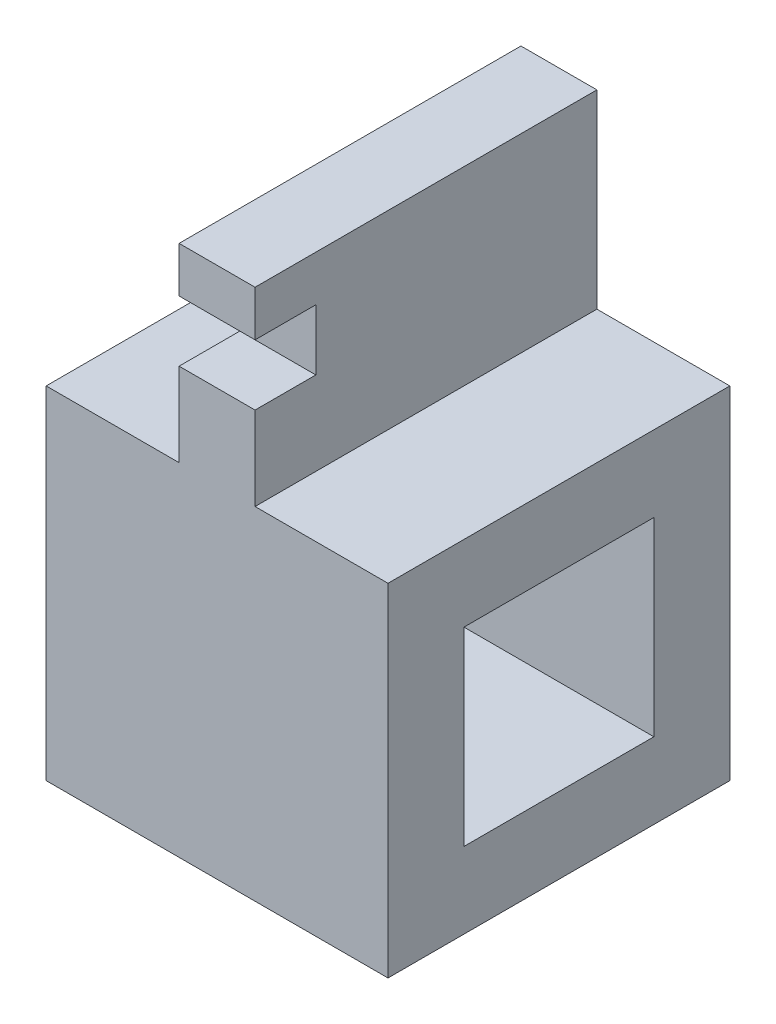
ISO-10303-21;
HEADER;
FILE_DESCRIPTION(('STEP AP214'),'2;1');
FILE_NAME('part.step','',(''),(''),'','','');
FILE_SCHEMA(('AUTOMOTIVE_DESIGN { 1 0 10303 214 1 1 1 1 }'));
ENDSEC;
DATA;
#1=APPLICATION_CONTEXT('core data for automotive mechanical design processes');
#2=APPLICATION_PROTOCOL_DEFINITION('international standard','automotive_design',2000,#1);
#3=PRODUCT_CONTEXT('',#1,'mechanical');
#4=PRODUCT('Part','Part','',(#3));
#5=PRODUCT_RELATED_PRODUCT_CATEGORY('part','',(#4));
#6=PRODUCT_DEFINITION_FORMATION('','',#4);
#7=PRODUCT_DEFINITION_CONTEXT('part definition',#1,'design');
#8=PRODUCT_DEFINITION('design','',#6,#7);
#9=PRODUCT_DEFINITION_SHAPE('','',#8);
#10=(LENGTH_UNIT() NAMED_UNIT(*) SI_UNIT(.MILLI.,.METRE.));
#11=(NAMED_UNIT(*) PLANE_ANGLE_UNIT() SI_UNIT($,.RADIAN.));
#12=(NAMED_UNIT(*) SI_UNIT($,.STERADIAN.) SOLID_ANGLE_UNIT());
#13=UNCERTAINTY_MEASURE_WITH_UNIT(LENGTH_MEASURE(1.E-05),#10,'distance_accuracy_value','');
#14=(GEOMETRIC_REPRESENTATION_CONTEXT(3) GLOBAL_UNCERTAINTY_ASSIGNED_CONTEXT((#13)) GLOBAL_UNIT_ASSIGNED_CONTEXT((#10,
#11,#12)) REPRESENTATION_CONTEXT('',''));
#15=CARTESIAN_POINT('',(0.,0.,0.));
#16=DIRECTION('',(0.,0.,1.));
#17=DIRECTION('',(1.,0.,0.));
#18=AXIS2_PLACEMENT_3D('',#15,#16,#17);
#19=CARTESIAN_POINT('',(9.,-4.5,4.5));
#20=DIRECTION('',(0.,0.,-1.));
#21=DIRECTION('',(0.,1.,0.));
#22=AXIS2_PLACEMENT_3D('',#19,#20,#21);
#23=PLANE('',#22);
#24=DIRECTION('',(-1.,0.,0.));
#25=VECTOR('',#24,1.);
#26=CARTESIAN_POINT('',(8.5,8.3,4.5));
#27=LINE('',#26,#25);
#28=CARTESIAN_POINT('',(5.5,8.3,4.5));
#29=VERTEX_POINT('',#28);
#30=CARTESIAN_POINT('',(3.5,8.3,4.5));
#31=VERTEX_POINT('',#30);
#32=EDGE_CURVE('E163',#29,#31,#27,.T.);
#33=ORIENTED_EDGE('',*,*,#32,.F.);
#34=DIRECTION('',(0.,-1.,0.));
#35=VECTOR('',#34,1.);
#36=CARTESIAN_POINT('',(5.5,9.5,4.5));
#37=LINE('',#36,#35);
#38=CARTESIAN_POINT('',(5.5,9.5,4.5));
#39=VERTEX_POINT('',#38);
#40=EDGE_CURVE('E197',#39,#29,#37,.T.);
#41=ORIENTED_EDGE('',*,*,#40,.F.);
#42=DIRECTION('',(1.,0.,0.));
#43=VECTOR('',#42,1.);
#44=CARTESIAN_POINT('',(0.,9.5,4.5));
#45=LINE('',#44,#43);
#46=CARTESIAN_POINT('',(3.5,9.5,4.5));
#47=VERTEX_POINT('',#46);
#48=EDGE_CURVE('E180',#47,#39,#45,.T.);
#49=ORIENTED_EDGE('',*,*,#48,.F.);
#50=DIRECTION('',(0.,-1.,0.));
#51=VECTOR('',#50,1.);
#52=CARTESIAN_POINT('',(3.5,9.5,4.5));
#53=LINE('',#52,#51);
#54=EDGE_CURVE('E201',#47,#31,#53,.T.);
#55=ORIENTED_EDGE('',*,*,#54,.T.);
#56=EDGE_LOOP('',(#33,#41,#49,#55));
#57=FACE_BOUND('',#56,.T.);
#58=ADVANCED_FACE('F36',(#57),#23,.F.);
#59=CARTESIAN_POINT('',(3.5,9.5,0.));
#60=DIRECTION('',(-1.,0.,0.));
#61=DIRECTION('',(0.,0.,1.));
#62=AXIS2_PLACEMENT_3D('',#59,#60,#61);
#63=PLANE('',#62);
#64=DIRECTION('',(0.,1.,0.));
#65=VECTOR('',#64,1.);
#66=CARTESIAN_POINT('',(3.5,0.,2.9));
#67=LINE('',#66,#65);
#68=CARTESIAN_POINT('',(3.5,6.7,2.9));
#69=VERTEX_POINT('',#68);
#70=CARTESIAN_POINT('',(3.5,8.3,2.9));
#71=VERTEX_POINT('',#70);
#72=EDGE_CURVE('E151',#69,#71,#67,.T.);
#73=ORIENTED_EDGE('',*,*,#72,.T.);
#74=DIRECTION('',(0.,0.,1.));
#75=VECTOR('',#74,1.);
#76=CARTESIAN_POINT('',(3.5,8.3,0.));
#77=LINE('',#76,#75);
#78=EDGE_CURVE('E160',#71,#31,#77,.T.);
#79=ORIENTED_EDGE('',*,*,#78,.T.);
#80=ORIENTED_EDGE('',*,*,#54,.F.);
#81=DIRECTION('',(0.,0.,-1.));
#82=VECTOR('',#81,1.);
#83=CARTESIAN_POINT('',(3.5,9.5,0.));
#84=LINE('',#83,#82);
#85=CARTESIAN_POINT('',(3.5,9.5,-4.5));
#86=VERTEX_POINT('',#85);
#87=EDGE_CURVE('E177',#47,#86,#84,.T.);
#88=ORIENTED_EDGE('',*,*,#87,.T.);
#89=DIRECTION('',(0.,-1.,0.));
#90=VECTOR('',#89,1.);
#91=CARTESIAN_POINT('',(3.5,9.5,-4.5));
#92=LINE('',#91,#90);
#93=CARTESIAN_POINT('',(3.5,4.5,-4.5));
#94=VERTEX_POINT('',#93);
#95=EDGE_CURVE('E187',#86,#94,#92,.T.);
#96=ORIENTED_EDGE('',*,*,#95,.T.);
#97=DIRECTION('',(0.,0.,-1.));
#98=VECTOR('',#97,1.);
#99=CARTESIAN_POINT('',(3.5,4.5,0.));
#100=LINE('',#99,#98);
#101=CARTESIAN_POINT('',(3.5,4.5,4.5));
#102=VERTEX_POINT('',#101);
#103=EDGE_CURVE('E59',#102,#94,#100,.T.);
#104=ORIENTED_EDGE('',*,*,#103,.F.);
#105=CARTESIAN_POINT('',(3.5,6.7,4.5));
#106=VERTEX_POINT('',#105);
#107=EDGE_CURVE('E200',#106,#102,#53,.T.);
#108=ORIENTED_EDGE('',*,*,#107,.F.);
#109=DIRECTION('',(0.,0.,1.));
#110=VECTOR('',#109,1.);
#111=CARTESIAN_POINT('',(3.5,6.7,0.));
#112=LINE('',#111,#110);
#113=EDGE_CURVE('E157',#69,#106,#112,.T.);
#114=ORIENTED_EDGE('',*,*,#113,.F.);
#115=EDGE_LOOP('',(#73,#79,#80,#88,#96,#104,#108,#114));
#116=FACE_BOUND('',#115,.T.);
#117=ADVANCED_FACE('F167',(#116),#63,.T.);
#118=CARTESIAN_POINT('',(5.5,9.5,0.));
#119=DIRECTION('',(-1.,0.,0.));
#120=DIRECTION('',(0.,0.,1.));
#121=AXIS2_PLACEMENT_3D('',#118,#119,#120);
#122=PLANE('',#121);
#123=DIRECTION('',(0.,0.,1.));
#124=VECTOR('',#123,1.);
#125=CARTESIAN_POINT('',(5.5,8.3,0.));
#126=LINE('',#125,#124);
#127=CARTESIAN_POINT('',(5.5,8.3,2.9));
#128=VERTEX_POINT('',#127);
#129=EDGE_CURVE('E11',#128,#29,#126,.T.);
#130=ORIENTED_EDGE('',*,*,#129,.F.);
#131=DIRECTION('',(0.,1.,0.));
#132=VECTOR('',#131,1.);
#133=CARTESIAN_POINT('',(5.5,9.5,2.9));
#134=LINE('',#133,#132);
#135=CARTESIAN_POINT('',(5.5,6.7,2.9));
#136=VERTEX_POINT('',#135);
#137=EDGE_CURVE('E154',#136,#128,#134,.T.);
#138=ORIENTED_EDGE('',*,*,#137,.F.);
#139=DIRECTION('',(0.,0.,1.));
#140=VECTOR('',#139,1.);
#141=CARTESIAN_POINT('',(5.5,6.7,0.));
#142=LINE('',#141,#140);
#143=CARTESIAN_POINT('',(5.5,6.7,4.5));
#144=VERTEX_POINT('',#143);
#145=EDGE_CURVE('E44',#136,#144,#142,.T.);
#146=ORIENTED_EDGE('',*,*,#145,.T.);
#147=CARTESIAN_POINT('',(5.5,4.5,4.5));
#148=VERTEX_POINT('',#147);
#149=EDGE_CURVE('E196',#144,#148,#37,.T.);
#150=ORIENTED_EDGE('',*,*,#149,.T.);
#151=DIRECTION('',(0.,0.,-1.));
#152=VECTOR('',#151,1.);
#153=CARTESIAN_POINT('',(5.5,4.5,0.));
#154=LINE('',#153,#152);
#155=CARTESIAN_POINT('',(5.5,4.5,-4.5));
#156=VERTEX_POINT('',#155);
#157=EDGE_CURVE('E181',#148,#156,#154,.T.);
#158=ORIENTED_EDGE('',*,*,#157,.T.);
#159=DIRECTION('',(0.,-1.,0.));
#160=VECTOR('',#159,1.);
#161=CARTESIAN_POINT('',(5.5,9.5,-4.5));
#162=LINE('',#161,#160);
#163=CARTESIAN_POINT('',(5.5,9.5,-4.5));
#164=VERTEX_POINT('',#163);
#165=EDGE_CURVE('E193',#164,#156,#162,.T.);
#166=ORIENTED_EDGE('',*,*,#165,.F.);
#167=DIRECTION('',(0.,0.,-1.));
#168=VECTOR('',#167,1.);
#169=CARTESIAN_POINT('',(5.5,9.5,0.));
#170=LINE('',#169,#168);
#171=EDGE_CURVE('E183',#39,#164,#170,.T.);
#172=ORIENTED_EDGE('',*,*,#171,.F.);
#173=ORIENTED_EDGE('',*,*,#40,.T.);
#174=EDGE_LOOP('',(#130,#138,#146,#150,#158,#166,#172,#173));
#175=FACE_BOUND('',#174,.T.);
#176=ADVANCED_FACE('F270',(#175),#122,.F.);
#177=CARTESIAN_POINT('',(9.,4.5,-4.5));
#178=DIRECTION('',(0.,-1.,0.));
#179=DIRECTION('',(0.,0.,-1.));
#180=AXIS2_PLACEMENT_3D('',#177,#178,#179);
#181=PLANE('',#180);
#182=ORIENTED_EDGE('',*,*,#157,.F.);
#183=DIRECTION('',(-1.,0.,0.));
#184=VECTOR('',#183,1.);
#185=CARTESIAN_POINT('',(9.,4.5,4.5));
#186=LINE('',#185,#184);
#187=CARTESIAN_POINT('',(9.,4.5,4.5));
#188=VERTEX_POINT('',#187);
#189=EDGE_CURVE('E255',#188,#148,#186,.T.);
#190=ORIENTED_EDGE('',*,*,#189,.F.);
#191=DIRECTION('',(0.,0.,1.));
#192=VECTOR('',#191,1.);
#193=CARTESIAN_POINT('',(9.,4.5,-4.5));
#194=LINE('',#193,#192);
#195=CARTESIAN_POINT('',(9.,4.5,-4.5));
#196=VERTEX_POINT('',#195);
#197=EDGE_CURVE('E243',#196,#188,#194,.T.);
#198=ORIENTED_EDGE('',*,*,#197,.F.);
#199=DIRECTION('',(-1.,0.,0.));
#200=VECTOR('',#199,1.);
#201=CARTESIAN_POINT('',(9.,4.5,-4.5));
#202=LINE('',#201,#200);
#203=EDGE_CURVE('E259',#196,#156,#202,.T.);
#204=ORIENTED_EDGE('',*,*,#203,.T.);
#205=EDGE_LOOP('',(#182,#190,#198,#204));
#206=FACE_BOUND('',#205,.T.);
#207=ADVANCED_FACE('F279',(#206),#181,.F.);
#208=CARTESIAN_POINT('',(9.,0.,0.));
#209=DIRECTION('',(1.,0.,0.));
#210=DIRECTION('',(0.,0.,-1.));
#211=AXIS2_PLACEMENT_3D('',#208,#209,#210);
#212=PLANE('',#211);
#213=DIRECTION('',(0.,-1.,0.));
#214=VECTOR('',#213,1.);
#215=CARTESIAN_POINT('',(9.,-4.5,4.5));
#216=LINE('',#215,#214);
#217=CARTESIAN_POINT('',(9.,-4.5,4.5));
#218=VERTEX_POINT('',#217);
#219=EDGE_CURVE('E235',#188,#218,#216,.T.);
#220=ORIENTED_EDGE('',*,*,#219,.T.);
#221=DIRECTION('',(0.,0.,-1.));
#222=VECTOR('',#221,1.);
#223=CARTESIAN_POINT('',(9.,-4.5,-4.5));
#224=LINE('',#223,#222);
#225=CARTESIAN_POINT('',(9.,-4.5,-4.5));
#226=VERTEX_POINT('',#225);
#227=EDGE_CURVE('E238',#218,#226,#224,.T.);
#228=ORIENTED_EDGE('',*,*,#227,.T.);
#229=DIRECTION('',(0.,1.,0.));
#230=VECTOR('',#229,1.);
#231=CARTESIAN_POINT('',(9.,-4.5,-4.5));
#232=LINE('',#231,#230);
#233=EDGE_CURVE('E241',#226,#196,#232,.T.);
#234=ORIENTED_EDGE('',*,*,#233,.T.);
#235=ORIENTED_EDGE('',*,*,#197,.T.);
#236=EDGE_LOOP('',(#220,#228,#234,#235));
#237=FACE_BOUND('',#236,.T.);
#238=DIRECTION('',(0.,0.,-1.));
#239=VECTOR('',#238,1.);
#240=CARTESIAN_POINT('',(9.,-2.5,-2.5));
#241=LINE('',#240,#239);
#242=CARTESIAN_POINT('',(9.,-2.5,2.5));
#243=VERTEX_POINT('',#242);
#244=CARTESIAN_POINT('',(9.,-2.5,-2.5));
#245=VERTEX_POINT('',#244);
#246=EDGE_CURVE('E206',#243,#245,#241,.T.);
#247=ORIENTED_EDGE('',*,*,#246,.F.);
#248=DIRECTION('',(0.,-1.,0.));
#249=VECTOR('',#248,1.);
#250=CARTESIAN_POINT('',(9.,-2.5,2.5));
#251=LINE('',#250,#249);
#252=CARTESIAN_POINT('',(9.,2.5,2.5));
#253=VERTEX_POINT('',#252);
#254=EDGE_CURVE('E204',#253,#243,#251,.T.);
#255=ORIENTED_EDGE('',*,*,#254,.F.);
#256=DIRECTION('',(0.,0.,1.));
#257=VECTOR('',#256,1.);
#258=CARTESIAN_POINT('',(9.,2.5,-2.5));
#259=LINE('',#258,#257);
#260=CARTESIAN_POINT('',(9.,2.5,-2.5));
#261=VERTEX_POINT('',#260);
#262=EDGE_CURVE('E212',#261,#253,#259,.T.);
#263=ORIENTED_EDGE('',*,*,#262,.F.);
#264=DIRECTION('',(0.,1.,0.));
#265=VECTOR('',#264,1.);
#266=CARTESIAN_POINT('',(9.,-2.5,-2.5));
#267=LINE('',#266,#265);
#268=EDGE_CURVE('E209',#245,#261,#267,.T.);
#269=ORIENTED_EDGE('',*,*,#268,.F.);
#270=EDGE_LOOP('',(#247,#255,#263,#269));
#271=FACE_BOUND('',#270,.T.);
#272=ADVANCED_FACE('F305',(#237,#271),#212,.T.);
#273=CARTESIAN_POINT('',(0.,0.,0.));
#274=DIRECTION('',(1.,0.,0.));
#275=DIRECTION('',(0.,0.,-1.));
#276=AXIS2_PLACEMENT_3D('',#273,#274,#275);
#277=PLANE('',#276);
#278=DIRECTION('',(0.,-1.,0.));
#279=VECTOR('',#278,1.);
#280=CARTESIAN_POINT('',(0.,-4.5,4.5));
#281=LINE('',#280,#279);
#282=CARTESIAN_POINT('',(0.,4.5,4.5));
#283=VERTEX_POINT('',#282);
#284=CARTESIAN_POINT('',(0.,-4.5,4.5));
#285=VERTEX_POINT('',#284);
#286=EDGE_CURVE('E234',#283,#285,#281,.T.);
#287=ORIENTED_EDGE('',*,*,#286,.F.);
#288=DIRECTION('',(0.,0.,1.));
#289=VECTOR('',#288,1.);
#290=CARTESIAN_POINT('',(0.,4.5,-4.5));
#291=LINE('',#290,#289);
#292=CARTESIAN_POINT('',(0.,4.5,-4.5));
#293=VERTEX_POINT('',#292);
#294=EDGE_CURVE('E239',#293,#283,#291,.T.);
#295=ORIENTED_EDGE('',*,*,#294,.F.);
#296=DIRECTION('',(0.,1.,0.));
#297=VECTOR('',#296,1.);
#298=CARTESIAN_POINT('',(0.,-4.5,-4.5));
#299=LINE('',#298,#297);
#300=CARTESIAN_POINT('',(0.,-4.5,-4.5));
#301=VERTEX_POINT('',#300);
#302=EDGE_CURVE('E250',#301,#293,#299,.T.);
#303=ORIENTED_EDGE('',*,*,#302,.F.);
#304=DIRECTION('',(0.,0.,-1.));
#305=VECTOR('',#304,1.);
#306=CARTESIAN_POINT('',(0.,-4.5,-4.5));
#307=LINE('',#306,#305);
#308=EDGE_CURVE('E248',#285,#301,#307,.T.);
#309=ORIENTED_EDGE('',*,*,#308,.F.);
#310=EDGE_LOOP('',(#287,#295,#303,#309));
#311=FACE_BOUND('',#310,.T.);
#312=DIRECTION('',(0.,-1.,0.));
#313=VECTOR('',#312,1.);
#314=CARTESIAN_POINT('',(0.,-2.5,2.5));
#315=LINE('',#314,#313);
#316=CARTESIAN_POINT('',(0.,2.5,2.5));
#317=VERTEX_POINT('',#316);
#318=CARTESIAN_POINT('',(0.,-2.5,2.5));
#319=VERTEX_POINT('',#318);
#320=EDGE_CURVE('E203',#317,#319,#315,.T.);
#321=ORIENTED_EDGE('',*,*,#320,.T.);
#322=DIRECTION('',(0.,0.,-1.));
#323=VECTOR('',#322,1.);
#324=CARTESIAN_POINT('',(0.,-2.5,-2.5));
#325=LINE('',#324,#323);
#326=CARTESIAN_POINT('',(0.,-2.5,-2.5));
#327=VERTEX_POINT('',#326);
#328=EDGE_CURVE('E217',#319,#327,#325,.T.);
#329=ORIENTED_EDGE('',*,*,#328,.T.);
#330=DIRECTION('',(0.,1.,0.));
#331=VECTOR('',#330,1.);
#332=CARTESIAN_POINT('',(0.,-2.5,-2.5));
#333=LINE('',#332,#331);
#334=CARTESIAN_POINT('',(0.,2.5,-2.5));
#335=VERTEX_POINT('',#334);
#336=EDGE_CURVE('E220',#327,#335,#333,.T.);
#337=ORIENTED_EDGE('',*,*,#336,.T.);
#338=DIRECTION('',(0.,0.,1.));
#339=VECTOR('',#338,1.);
#340=CARTESIAN_POINT('',(0.,2.5,-2.5));
#341=LINE('',#340,#339);
#342=EDGE_CURVE('E207',#335,#317,#341,.T.);
#343=ORIENTED_EDGE('',*,*,#342,.T.);
#344=EDGE_LOOP('',(#321,#329,#337,#343));
#345=FACE_BOUND('',#344,.T.);
#346=ADVANCED_FACE('F299',(#311,#345),#277,.F.);
#347=ORIENTED_EDGE('',*,*,#149,.F.);
#348=DIRECTION('',(-1.,0.,0.));
#349=VECTOR('',#348,1.);
#350=CARTESIAN_POINT('',(8.5,6.7,4.5));
#351=LINE('',#350,#349);
#352=EDGE_CURVE('E173',#144,#106,#351,.T.);
#353=ORIENTED_EDGE('',*,*,#352,.T.);
#354=ORIENTED_EDGE('',*,*,#107,.T.);
#355=EDGE_CURVE('E245',#102,#283,#186,.T.);
#356=ORIENTED_EDGE('',*,*,#355,.T.);
#357=ORIENTED_EDGE('',*,*,#286,.T.);
#358=DIRECTION('',(-1.,0.,0.));
#359=VECTOR('',#358,1.);
#360=CARTESIAN_POINT('',(9.,-4.5,4.5));
#361=LINE('',#360,#359);
#362=EDGE_CURVE('E264',#218,#285,#361,.T.);
#363=ORIENTED_EDGE('',*,*,#362,.F.);
#364=ORIENTED_EDGE('',*,*,#219,.F.);
#365=ORIENTED_EDGE('',*,*,#189,.T.);
#366=EDGE_LOOP('',(#347,#353,#354,#356,#357,#363,#364,#365));
#367=FACE_BOUND('',#366,.T.);
#368=ADVANCED_FACE('F38',(#367),#23,.F.);
#369=CARTESIAN_POINT('',(9.,-4.5,-4.5));
#370=DIRECTION('',(0.,1.,0.));
#371=DIRECTION('',(0.,0.,1.));
#372=AXIS2_PLACEMENT_3D('',#369,#370,#371);
#373=PLANE('',#372);
#374=ORIENTED_EDGE('',*,*,#308,.T.);
#375=DIRECTION('',(-1.,0.,0.));
#376=VECTOR('',#375,1.);
#377=CARTESIAN_POINT('',(9.,-4.5,-4.5));
#378=LINE('',#377,#376);
#379=EDGE_CURVE('E261',#226,#301,#378,.T.);
#380=ORIENTED_EDGE('',*,*,#379,.F.);
#381=ORIENTED_EDGE('',*,*,#227,.F.);
#382=ORIENTED_EDGE('',*,*,#362,.T.);
#383=EDGE_LOOP('',(#374,#380,#381,#382));
#384=FACE_BOUND('',#383,.T.);
#385=ADVANCED_FACE('F302',(#384),#373,.F.);
#386=CARTESIAN_POINT('',(9.,-4.5,-4.5));
#387=DIRECTION('',(0.,0.,1.));
#388=DIRECTION('',(0.,-1.,0.));
#389=AXIS2_PLACEMENT_3D('',#386,#387,#388);
#390=PLANE('',#389);
#391=ORIENTED_EDGE('',*,*,#302,.T.);
#392=EDGE_CURVE('E258',#94,#293,#202,.T.);
#393=ORIENTED_EDGE('',*,*,#392,.F.);
#394=ORIENTED_EDGE('',*,*,#95,.F.);
#395=DIRECTION('',(-1.,0.,0.));
#396=VECTOR('',#395,1.);
#397=CARTESIAN_POINT('',(0.,9.5,-4.5));
#398=LINE('',#397,#396);
#399=EDGE_CURVE('E185',#164,#86,#398,.T.);
#400=ORIENTED_EDGE('',*,*,#399,.F.);
#401=ORIENTED_EDGE('',*,*,#165,.T.);
#402=ORIENTED_EDGE('',*,*,#203,.F.);
#403=ORIENTED_EDGE('',*,*,#233,.F.);
#404=ORIENTED_EDGE('',*,*,#379,.T.);
#405=EDGE_LOOP('',(#391,#393,#394,#400,#401,#402,#403,#404));
#406=FACE_BOUND('',#405,.T.);
#407=ADVANCED_FACE('F285',(#406),#390,.F.);
#408=ORIENTED_EDGE('',*,*,#355,.F.);
#409=ORIENTED_EDGE('',*,*,#103,.T.);
#410=ORIENTED_EDGE('',*,*,#392,.T.);
#411=ORIENTED_EDGE('',*,*,#294,.T.);
#412=EDGE_LOOP('',(#408,#409,#410,#411));
#413=FACE_BOUND('',#412,.T.);
#414=ADVANCED_FACE('F294',(#413),#181,.F.);
#415=CARTESIAN_POINT('',(9.,-2.5,2.5));
#416=DIRECTION('',(0.,0.,-1.));
#417=DIRECTION('',(-1.,0.,0.));
#418=AXIS2_PLACEMENT_3D('',#415,#416,#417);
#419=PLANE('',#418);
#420=ORIENTED_EDGE('',*,*,#320,.F.);
#421=DIRECTION('',(-1.,0.,0.));
#422=VECTOR('',#421,1.);
#423=CARTESIAN_POINT('',(9.,2.5,2.5));
#424=LINE('',#423,#422);
#425=EDGE_CURVE('E214',#253,#317,#424,.T.);
#426=ORIENTED_EDGE('',*,*,#425,.F.);
#427=ORIENTED_EDGE('',*,*,#254,.T.);
#428=DIRECTION('',(-1.,0.,0.));
#429=VECTOR('',#428,1.);
#430=CARTESIAN_POINT('',(9.,-2.5,2.5));
#431=LINE('',#430,#429);
#432=EDGE_CURVE('E231',#243,#319,#431,.T.);
#433=ORIENTED_EDGE('',*,*,#432,.T.);
#434=EDGE_LOOP('',(#420,#426,#427,#433));
#435=FACE_BOUND('',#434,.T.);
#436=ADVANCED_FACE('F322',(#435),#419,.T.);
#437=CARTESIAN_POINT('',(9.,-2.5,-2.5));
#438=DIRECTION('',(0.,1.,0.));
#439=DIRECTION('',(0.,0.,1.));
#440=AXIS2_PLACEMENT_3D('',#437,#438,#439);
#441=PLANE('',#440);
#442=ORIENTED_EDGE('',*,*,#328,.F.);
#443=ORIENTED_EDGE('',*,*,#432,.F.);
#444=ORIENTED_EDGE('',*,*,#246,.T.);
#445=DIRECTION('',(-1.,0.,0.));
#446=VECTOR('',#445,1.);
#447=CARTESIAN_POINT('',(9.,-2.5,-2.5));
#448=LINE('',#447,#446);
#449=EDGE_CURVE('E229',#245,#327,#448,.T.);
#450=ORIENTED_EDGE('',*,*,#449,.T.);
#451=EDGE_LOOP('',(#442,#443,#444,#450));
#452=FACE_BOUND('',#451,.T.);
#453=ADVANCED_FACE('F316',(#452),#441,.T.);
#454=CARTESIAN_POINT('',(9.,-2.5,-2.5));
#455=DIRECTION('',(0.,0.,1.));
#456=DIRECTION('',(1.,0.,0.));
#457=AXIS2_PLACEMENT_3D('',#454,#455,#456);
#458=PLANE('',#457);
#459=ORIENTED_EDGE('',*,*,#336,.F.);
#460=ORIENTED_EDGE('',*,*,#449,.F.);
#461=ORIENTED_EDGE('',*,*,#268,.T.);
#462=DIRECTION('',(-1.,0.,0.));
#463=VECTOR('',#462,1.);
#464=CARTESIAN_POINT('',(9.,2.5,-2.5));
#465=LINE('',#464,#463);
#466=EDGE_CURVE('E227',#261,#335,#465,.T.);
#467=ORIENTED_EDGE('',*,*,#466,.T.);
#468=EDGE_LOOP('',(#459,#460,#461,#467));
#469=FACE_BOUND('',#468,.T.);
#470=ADVANCED_FACE('F319',(#469),#458,.T.);
#471=CARTESIAN_POINT('',(9.,2.5,-2.5));
#472=DIRECTION('',(0.,-1.,0.));
#473=DIRECTION('',(0.,0.,-1.));
#474=AXIS2_PLACEMENT_3D('',#471,#472,#473);
#475=PLANE('',#474);
#476=ORIENTED_EDGE('',*,*,#342,.F.);
#477=ORIENTED_EDGE('',*,*,#466,.F.);
#478=ORIENTED_EDGE('',*,*,#262,.T.);
#479=ORIENTED_EDGE('',*,*,#425,.T.);
#480=EDGE_LOOP('',(#476,#477,#478,#479));
#481=FACE_BOUND('',#480,.T.);
#482=ADVANCED_FACE('F325',(#481),#475,.T.);
#483=CARTESIAN_POINT('',(0.,9.5,0.));
#484=DIRECTION('',(0.,1.,0.));
#485=DIRECTION('',(0.,0.,1.));
#486=AXIS2_PLACEMENT_3D('',#483,#484,#485);
#487=PLANE('',#486);
#488=ORIENTED_EDGE('',*,*,#87,.F.);
#489=ORIENTED_EDGE('',*,*,#48,.T.);
#490=ORIENTED_EDGE('',*,*,#171,.T.);
#491=ORIENTED_EDGE('',*,*,#399,.T.);
#492=EDGE_LOOP('',(#488,#489,#490,#491));
#493=FACE_BOUND('',#492,.T.);
#494=ADVANCED_FACE('F290',(#493),#487,.T.);
#495=CARTESIAN_POINT('',(8.5,8.3,0.));
#496=DIRECTION('',(0.,-1.,0.));
#497=DIRECTION('',(1.,0.,0.));
#498=AXIS2_PLACEMENT_3D('',#495,#496,#497);
#499=PLANE('',#498);
#500=ORIENTED_EDGE('',*,*,#129,.T.);
#501=ORIENTED_EDGE('',*,*,#32,.T.);
#502=ORIENTED_EDGE('',*,*,#78,.F.);
#503=DIRECTION('',(-1.,0.,0.));
#504=VECTOR('',#503,1.);
#505=CARTESIAN_POINT('',(8.5,8.3,2.9));
#506=LINE('',#505,#504);
#507=EDGE_CURVE('E147',#128,#71,#506,.T.);
#508=ORIENTED_EDGE('',*,*,#507,.F.);
#509=EDGE_LOOP('',(#500,#501,#502,#508));
#510=FACE_BOUND('',#509,.T.);
#511=ADVANCED_FACE('F161',(#510),#499,.T.);
#512=CARTESIAN_POINT('',(8.5,6.7,0.));
#513=DIRECTION('',(0.,-1.,0.));
#514=DIRECTION('',(1.,0.,0.));
#515=AXIS2_PLACEMENT_3D('',#512,#513,#514);
#516=PLANE('',#515);
#517=DIRECTION('',(-1.,0.,0.));
#518=VECTOR('',#517,1.);
#519=CARTESIAN_POINT('',(8.5,6.7,2.9));
#520=LINE('',#519,#518);
#521=EDGE_CURVE('E51',#136,#69,#520,.T.);
#522=ORIENTED_EDGE('',*,*,#521,.T.);
#523=ORIENTED_EDGE('',*,*,#113,.T.);
#524=ORIENTED_EDGE('',*,*,#352,.F.);
#525=ORIENTED_EDGE('',*,*,#145,.F.);
#526=EDGE_LOOP('',(#522,#523,#524,#525));
#527=FACE_BOUND('',#526,.T.);
#528=ADVANCED_FACE('F442',(#527),#516,.F.);
#529=CARTESIAN_POINT('',(8.5,0.,2.9));
#530=DIRECTION('',(0.,0.,1.));
#531=DIRECTION('',(0.,-1.,0.));
#532=AXIS2_PLACEMENT_3D('',#529,#530,#531);
#533=PLANE('',#532);
#534=ORIENTED_EDGE('',*,*,#137,.T.);
#535=ORIENTED_EDGE('',*,*,#507,.T.);
#536=ORIENTED_EDGE('',*,*,#72,.F.);
#537=ORIENTED_EDGE('',*,*,#521,.F.);
#538=EDGE_LOOP('',(#534,#535,#536,#537));
#539=FACE_BOUND('',#538,.T.);
#540=ADVANCED_FACE('F149',(#539),#533,.T.);
#541=CLOSED_SHELL('',(#58,#117,#176,#207,#272,#346,#368,#385,#407,#414,#436,#453,#470,#482,#494,
#511,#528,#540));
#542=MANIFOLD_SOLID_BREP('B2',#541);
#543=ADVANCED_BREP_SHAPE_REPRESENTATION('',(#18,#542),#14);
#544=SHAPE_DEFINITION_REPRESENTATION(#9,#543);
ENDSEC;
END-ISO-10303-21;
